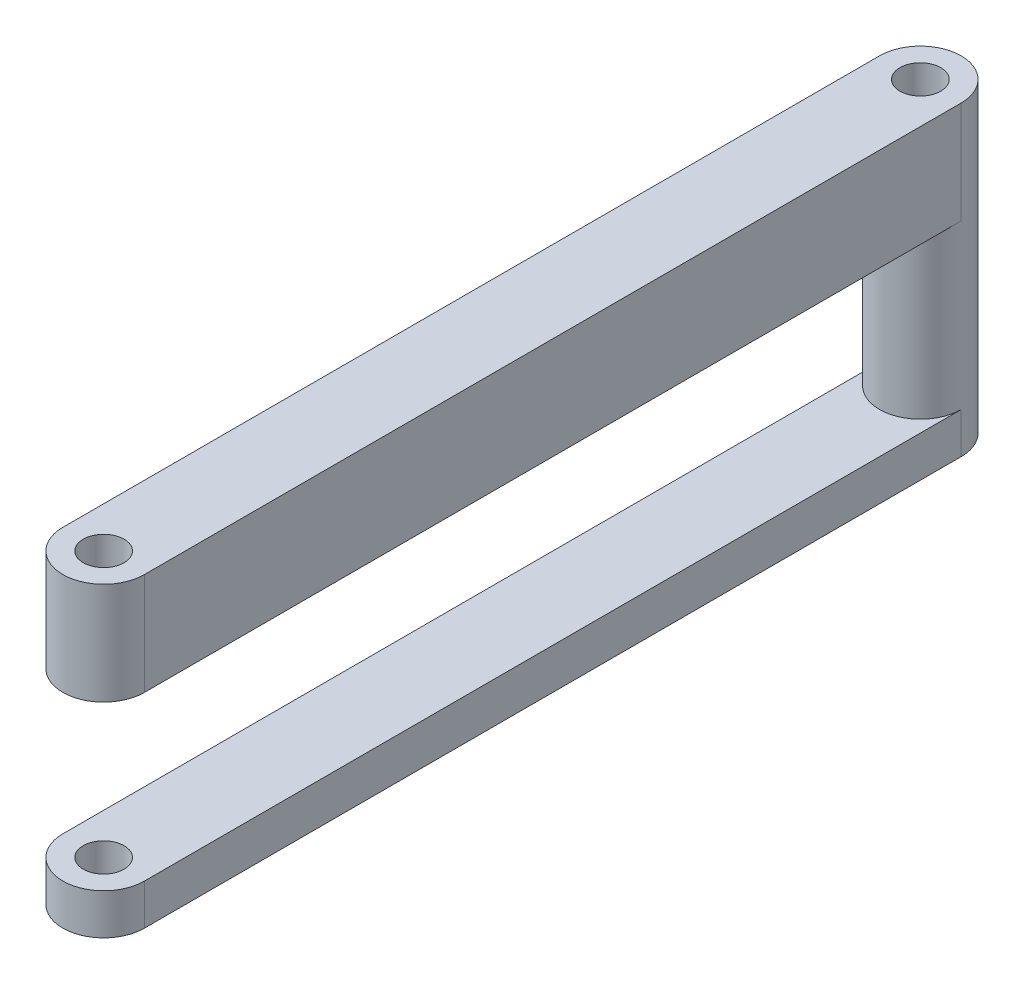
ISO-10303-21;
HEADER;
FILE_DESCRIPTION(('STEP AP214'),'2;1');
FILE_NAME('part.step','',(''),(''),'','','');
FILE_SCHEMA(('AUTOMOTIVE_DESIGN { 1 0 10303 214 1 1 1 1 }'));
ENDSEC;
DATA;
#1=APPLICATION_CONTEXT('core data for automotive mechanical design processes');
#2=APPLICATION_PROTOCOL_DEFINITION('international standard','automotive_design',2000,#1);
#3=PRODUCT_CONTEXT('',#1,'mechanical');
#4=PRODUCT('Part','Part','',(#3));
#5=PRODUCT_RELATED_PRODUCT_CATEGORY('part','',(#4));
#6=PRODUCT_DEFINITION_FORMATION('','',#4);
#7=PRODUCT_DEFINITION_CONTEXT('part definition',#1,'design');
#8=PRODUCT_DEFINITION('design','',#6,#7);
#9=PRODUCT_DEFINITION_SHAPE('','',#8);
#10=(LENGTH_UNIT() NAMED_UNIT(*) SI_UNIT(.MILLI.,.METRE.));
#11=(NAMED_UNIT(*) PLANE_ANGLE_UNIT() SI_UNIT($,.RADIAN.));
#12=(NAMED_UNIT(*) SI_UNIT($,.STERADIAN.) SOLID_ANGLE_UNIT());
#13=UNCERTAINTY_MEASURE_WITH_UNIT(LENGTH_MEASURE(1.E-05),#10,'distance_accuracy_value','');
#14=(GEOMETRIC_REPRESENTATION_CONTEXT(3) GLOBAL_UNCERTAINTY_ASSIGNED_CONTEXT((#13)) GLOBAL_UNIT_ASSIGNED_CONTEXT((#10,
#11,#12)) REPRESENTATION_CONTEXT('',''));
#15=CARTESIAN_POINT('',(0.,0.,0.));
#16=DIRECTION('',(0.,0.,1.));
#17=DIRECTION('',(1.,0.,0.));
#18=AXIS2_PLACEMENT_3D('',#15,#16,#17);
#19=CARTESIAN_POINT('',(0.,2.,0.));
#20=DIRECTION('',(0.,-1.,0.));
#21=DIRECTION('',(0.,0.,-1.));
#22=AXIS2_PLACEMENT_3D('',#19,#20,#21);
#23=CYLINDRICAL_SURFACE('',#22,2.);
#24=CARTESIAN_POINT('',(0.,0.,0.));
#25=DIRECTION('',(0.,1.,0.));
#26=DIRECTION('',(0.,0.,1.));
#27=AXIS2_PLACEMENT_3D('',#24,#25,#26);
#28=CIRCLE('',#27,2.);
#29=CARTESIAN_POINT('',(2.,0.,0.));
#30=VERTEX_POINT('',#29);
#31=CARTESIAN_POINT('',(-2.,0.,0.));
#32=VERTEX_POINT('',#31);
#33=EDGE_CURVE('E112',#30,#32,#28,.T.);
#34=ORIENTED_EDGE('',*,*,#33,.T.);
#35=DIRECTION('',(0.,-1.,0.));
#36=VECTOR('',#35,1.);
#37=CARTESIAN_POINT('',(-2.,2.,0.));
#38=LINE('',#37,#36);
#39=CARTESIAN_POINT('',(-2.,2.,0.));
#40=VERTEX_POINT('',#39);
#41=EDGE_CURVE('E123',#40,#32,#38,.T.);
#42=ORIENTED_EDGE('',*,*,#41,.F.);
#43=CARTESIAN_POINT('',(0.,2.,0.));
#44=DIRECTION('',(0.,1.,0.));
#45=DIRECTION('',(0.,0.,1.));
#46=AXIS2_PLACEMENT_3D('',#43,#44,#45);
#47=CIRCLE('',#46,2.);
#48=CARTESIAN_POINT('',(2.,2.,0.));
#49=VERTEX_POINT('',#48);
#50=EDGE_CURVE('E41',#40,#49,#47,.T.);
#51=ORIENTED_EDGE('',*,*,#50,.T.);
#52=DIRECTION('',(0.,-1.,0.));
#53=VECTOR('',#52,1.);
#54=CARTESIAN_POINT('',(2.,2.,0.));
#55=LINE('',#54,#53);
#56=EDGE_CURVE('E131',#49,#30,#55,.T.);
#57=ORIENTED_EDGE('',*,*,#56,.T.);
#58=EDGE_LOOP('',(#34,#42,#51,#57));
#59=FACE_BOUND('',#58,.T.);
#60=CARTESIAN_POINT('',(0.,10.,0.));
#61=DIRECTION('',(0.,1.,0.));
#62=DIRECTION('',(0.,0.,1.));
#63=AXIS2_PLACEMENT_3D('',#60,#61,#62);
#64=CIRCLE('',#63,2.);
#65=CARTESIAN_POINT('',(-2.,10.,0.));
#66=VERTEX_POINT('',#65);
#67=CARTESIAN_POINT('',(2.,10.,0.));
#68=VERTEX_POINT('',#67);
#69=EDGE_CURVE('E11',#66,#68,#64,.T.);
#70=ORIENTED_EDGE('',*,*,#69,.F.);
#71=DIRECTION('',(0.,-1.,0.));
#72=VECTOR('',#71,1.);
#73=CARTESIAN_POINT('',(-2.,15.,0.));
#74=LINE('',#73,#72);
#75=CARTESIAN_POINT('',(-2.,15.,0.));
#76=VERTEX_POINT('',#75);
#77=EDGE_CURVE('E55',#76,#66,#74,.T.);
#78=ORIENTED_EDGE('',*,*,#77,.F.);
#79=CARTESIAN_POINT('',(0.,15.,0.));
#80=DIRECTION('',(0.,1.,0.));
#81=DIRECTION('',(0.,0.,1.));
#82=AXIS2_PLACEMENT_3D('',#79,#80,#81);
#83=CIRCLE('',#82,2.);
#84=CARTESIAN_POINT('',(2.,15.,0.));
#85=VERTEX_POINT('',#84);
#86=EDGE_CURVE('E103',#85,#76,#83,.T.);
#87=ORIENTED_EDGE('',*,*,#86,.F.);
#88=DIRECTION('',(0.,-1.,0.));
#89=VECTOR('',#88,1.);
#90=CARTESIAN_POINT('',(2.,15.,0.));
#91=LINE('',#90,#89);
#92=EDGE_CURVE('E48',#85,#68,#91,.T.);
#93=ORIENTED_EDGE('',*,*,#92,.T.);
#94=EDGE_LOOP('',(#70,#78,#87,#93));
#95=FACE_BOUND('',#94,.T.);
#96=ADVANCED_FACE('F33',(#59,#95),#23,.T.);
#97=CARTESIAN_POINT('',(-2.,2.,0.));
#98=DIRECTION('',(1.,0.,0.));
#99=DIRECTION('',(0.,0.,-1.));
#100=AXIS2_PLACEMENT_3D('',#97,#98,#99);
#101=PLANE('',#100);
#102=DIRECTION('',(0.,0.,1.));
#103=VECTOR('',#102,1.);
#104=CARTESIAN_POINT('',(-2.,0.,0.));
#105=LINE('',#104,#103);
#106=CARTESIAN_POINT('',(-2.,0.,40.));
#107=VERTEX_POINT('',#106);
#108=EDGE_CURVE('E115',#32,#107,#105,.T.);
#109=ORIENTED_EDGE('',*,*,#108,.T.);
#110=DIRECTION('',(0.,-1.,0.));
#111=VECTOR('',#110,1.);
#112=CARTESIAN_POINT('',(-2.,2.,40.));
#113=LINE('',#112,#111);
#114=CARTESIAN_POINT('',(-2.,2.,40.));
#115=VERTEX_POINT('',#114);
#116=EDGE_CURVE('E142',#115,#107,#113,.T.);
#117=ORIENTED_EDGE('',*,*,#116,.F.);
#118=DIRECTION('',(0.,0.,1.));
#119=VECTOR('',#118,1.);
#120=CARTESIAN_POINT('',(-2.,2.,0.));
#121=LINE('',#120,#119);
#122=EDGE_CURVE('E124',#40,#115,#121,.T.);
#123=ORIENTED_EDGE('',*,*,#122,.F.);
#124=ORIENTED_EDGE('',*,*,#41,.T.);
#125=EDGE_LOOP('',(#109,#117,#123,#124));
#126=FACE_BOUND('',#125,.T.);
#127=ADVANCED_FACE('F149',(#126),#101,.F.);
#128=CARTESIAN_POINT('',(0.,2.,40.));
#129=DIRECTION('',(0.,-1.,0.));
#130=DIRECTION('',(0.,0.,-1.));
#131=AXIS2_PLACEMENT_3D('',#128,#129,#130);
#132=CYLINDRICAL_SURFACE('',#131,2.);
#133=CARTESIAN_POINT('',(0.,0.,40.));
#134=DIRECTION('',(0.,1.,0.));
#135=DIRECTION('',(0.,0.,1.));
#136=AXIS2_PLACEMENT_3D('',#133,#134,#135);
#137=CIRCLE('',#136,2.);
#138=CARTESIAN_POINT('',(2.,0.,40.));
#139=VERTEX_POINT('',#138);
#140=EDGE_CURVE('E134',#107,#139,#137,.T.);
#141=ORIENTED_EDGE('',*,*,#140,.T.);
#142=DIRECTION('',(0.,-1.,0.));
#143=VECTOR('',#142,1.);
#144=CARTESIAN_POINT('',(2.,2.,40.));
#145=LINE('',#144,#143);
#146=CARTESIAN_POINT('',(2.,2.,40.));
#147=VERTEX_POINT('',#146);
#148=EDGE_CURVE('E140',#147,#139,#145,.T.);
#149=ORIENTED_EDGE('',*,*,#148,.F.);
#150=CARTESIAN_POINT('',(0.,2.,40.));
#151=DIRECTION('',(0.,1.,0.));
#152=DIRECTION('',(0.,0.,1.));
#153=AXIS2_PLACEMENT_3D('',#150,#151,#152);
#154=CIRCLE('',#153,2.);
#155=EDGE_CURVE('E126',#115,#147,#154,.T.);
#156=ORIENTED_EDGE('',*,*,#155,.F.);
#157=ORIENTED_EDGE('',*,*,#116,.T.);
#158=EDGE_LOOP('',(#141,#149,#156,#157));
#159=FACE_BOUND('',#158,.T.);
#160=ADVANCED_FACE('F163',(#159),#132,.T.);
#161=CARTESIAN_POINT('',(2.,2.,0.));
#162=DIRECTION('',(1.,0.,0.));
#163=DIRECTION('',(0.,0.,-1.));
#164=AXIS2_PLACEMENT_3D('',#161,#162,#163);
#165=PLANE('',#164);
#166=DIRECTION('',(0.,0.,1.));
#167=VECTOR('',#166,1.);
#168=CARTESIAN_POINT('',(2.,0.,0.));
#169=LINE('',#168,#167);
#170=EDGE_CURVE('E127',#30,#139,#169,.T.);
#171=ORIENTED_EDGE('',*,*,#170,.F.);
#172=ORIENTED_EDGE('',*,*,#56,.F.);
#173=DIRECTION('',(0.,0.,1.));
#174=VECTOR('',#173,1.);
#175=CARTESIAN_POINT('',(2.,2.,0.));
#176=LINE('',#175,#174);
#177=EDGE_CURVE('E129',#49,#147,#176,.T.);
#178=ORIENTED_EDGE('',*,*,#177,.T.);
#179=ORIENTED_EDGE('',*,*,#148,.T.);
#180=EDGE_LOOP('',(#171,#172,#178,#179));
#181=FACE_BOUND('',#180,.T.);
#182=ADVANCED_FACE('F159',(#181),#165,.T.);
#183=CARTESIAN_POINT('',(0.,2.,0.));
#184=DIRECTION('',(0.,1.,0.));
#185=DIRECTION('',(0.,0.,1.));
#186=AXIS2_PLACEMENT_3D('',#183,#184,#185);
#187=PLANE('',#186);
#188=CARTESIAN_POINT('',(0.,2.,40.));
#189=DIRECTION('',(0.,1.,0.));
#190=DIRECTION('',(0.,0.,1.));
#191=AXIS2_PLACEMENT_3D('',#188,#189,#190);
#192=CIRCLE('',#191,0.999999999999992);
#193=CARTESIAN_POINT('',(0.,2.,41.));
#194=VERTEX_POINT('',#193);
#195=EDGE_CURVE('E36',#194,#194,#192,.T.);
#196=ORIENTED_EDGE('',*,*,#195,.F.);
#197=EDGE_LOOP('',(#196));
#198=FACE_BOUND('',#197,.T.);
#199=ORIENTED_EDGE('',*,*,#50,.F.);
#200=ORIENTED_EDGE('',*,*,#122,.T.);
#201=ORIENTED_EDGE('',*,*,#155,.T.);
#202=ORIENTED_EDGE('',*,*,#177,.F.);
#203=EDGE_LOOP('',(#199,#200,#201,#202));
#204=FACE_BOUND('',#203,.T.);
#205=ADVANCED_FACE('F165',(#198,#204),#187,.T.);
#206=CARTESIAN_POINT('',(0.,0.,0.));
#207=DIRECTION('',(0.,1.,0.));
#208=DIRECTION('',(0.,0.,1.));
#209=AXIS2_PLACEMENT_3D('',#206,#207,#208);
#210=PLANE('',#209);
#211=CARTESIAN_POINT('',(0.,0.,0.));
#212=DIRECTION('',(0.,1.,0.));
#213=DIRECTION('',(0.,0.,1.));
#214=AXIS2_PLACEMENT_3D('',#211,#212,#213);
#215=CIRCLE('',#214,0.999999999999996);
#216=CARTESIAN_POINT('',(0.,0.,0.999999999999996));
#217=VERTEX_POINT('',#216);
#218=EDGE_CURVE('E294',#217,#217,#215,.T.);
#219=ORIENTED_EDGE('',*,*,#218,.T.);
#220=EDGE_LOOP('',(#219));
#221=FACE_BOUND('',#220,.T.);
#222=CARTESIAN_POINT('',(0.,0.,40.));
#223=DIRECTION('',(0.,1.,0.));
#224=DIRECTION('',(0.,0.,1.));
#225=AXIS2_PLACEMENT_3D('',#222,#223,#224);
#226=CIRCLE('',#225,0.999999999999996);
#227=CARTESIAN_POINT('',(0.,0.,41.));
#228=VERTEX_POINT('',#227);
#229=EDGE_CURVE('E304',#228,#228,#226,.T.);
#230=ORIENTED_EDGE('',*,*,#229,.T.);
#231=EDGE_LOOP('',(#230));
#232=FACE_BOUND('',#231,.T.);
#233=ORIENTED_EDGE('',*,*,#33,.F.);
#234=ORIENTED_EDGE('',*,*,#170,.T.);
#235=ORIENTED_EDGE('',*,*,#140,.F.);
#236=ORIENTED_EDGE('',*,*,#108,.F.);
#237=EDGE_LOOP('',(#233,#234,#235,#236));
#238=FACE_BOUND('',#237,.T.);
#239=ADVANCED_FACE('F156',(#221,#232,#238),#210,.F.);
#240=CARTESIAN_POINT('',(-2.,15.,0.));
#241=DIRECTION('',(1.,0.,0.));
#242=DIRECTION('',(0.,0.,-1.));
#243=AXIS2_PLACEMENT_3D('',#240,#241,#242);
#244=PLANE('',#243);
#245=DIRECTION('',(0.,0.,1.));
#246=VECTOR('',#245,1.);
#247=CARTESIAN_POINT('',(-2.,10.,0.));
#248=LINE('',#247,#246);
#249=CARTESIAN_POINT('',(-2.,10.,40.));
#250=VERTEX_POINT('',#249);
#251=EDGE_CURVE('E309',#66,#250,#248,.T.);
#252=ORIENTED_EDGE('',*,*,#251,.T.);
#253=DIRECTION('',(0.,-1.,0.));
#254=VECTOR('',#253,1.);
#255=CARTESIAN_POINT('',(-2.,15.,40.));
#256=LINE('',#255,#254);
#257=CARTESIAN_POINT('',(-2.,15.,40.));
#258=VERTEX_POINT('',#257);
#259=EDGE_CURVE('E99',#258,#250,#256,.T.);
#260=ORIENTED_EDGE('',*,*,#259,.F.);
#261=DIRECTION('',(0.,0.,1.));
#262=VECTOR('',#261,1.);
#263=CARTESIAN_POINT('',(-2.,15.,0.));
#264=LINE('',#263,#262);
#265=EDGE_CURVE('E95',#76,#258,#264,.T.);
#266=ORIENTED_EDGE('',*,*,#265,.F.);
#267=ORIENTED_EDGE('',*,*,#77,.T.);
#268=EDGE_LOOP('',(#252,#260,#266,#267));
#269=FACE_BOUND('',#268,.T.);
#270=ADVANCED_FACE('F97',(#269),#244,.F.);
#271=CARTESIAN_POINT('',(0.,15.,40.));
#272=DIRECTION('',(0.,-1.,0.));
#273=DIRECTION('',(0.,0.,-1.));
#274=AXIS2_PLACEMENT_3D('',#271,#272,#273);
#275=CYLINDRICAL_SURFACE('',#274,2.);
#276=CARTESIAN_POINT('',(0.,10.,40.));
#277=DIRECTION('',(0.,1.,0.));
#278=DIRECTION('',(0.,0.,1.));
#279=AXIS2_PLACEMENT_3D('',#276,#277,#278);
#280=CIRCLE('',#279,2.);
#281=CARTESIAN_POINT('',(2.,10.,40.));
#282=VERTEX_POINT('',#281);
#283=EDGE_CURVE('E314',#250,#282,#280,.T.);
#284=ORIENTED_EDGE('',*,*,#283,.T.);
#285=DIRECTION('',(0.,-1.,0.));
#286=VECTOR('',#285,1.);
#287=CARTESIAN_POINT('',(2.,15.,40.));
#288=LINE('',#287,#286);
#289=CARTESIAN_POINT('',(2.,15.,40.));
#290=VERTEX_POINT('',#289);
#291=EDGE_CURVE('E117',#290,#282,#288,.T.);
#292=ORIENTED_EDGE('',*,*,#291,.F.);
#293=CARTESIAN_POINT('',(0.,15.,40.));
#294=DIRECTION('',(0.,1.,0.));
#295=DIRECTION('',(0.,0.,1.));
#296=AXIS2_PLACEMENT_3D('',#293,#294,#295);
#297=CIRCLE('',#296,2.);
#298=EDGE_CURVE('E102',#258,#290,#297,.T.);
#299=ORIENTED_EDGE('',*,*,#298,.F.);
#300=ORIENTED_EDGE('',*,*,#259,.T.);
#301=EDGE_LOOP('',(#284,#292,#299,#300));
#302=FACE_BOUND('',#301,.T.);
#303=ADVANCED_FACE('F211',(#302),#275,.T.);
#304=CARTESIAN_POINT('',(2.,15.,0.));
#305=DIRECTION('',(-1.,0.,0.));
#306=DIRECTION('',(0.,0.,1.));
#307=AXIS2_PLACEMENT_3D('',#304,#305,#306);
#308=PLANE('',#307);
#309=DIRECTION('',(0.,0.,-1.));
#310=VECTOR('',#309,1.);
#311=CARTESIAN_POINT('',(2.,10.,0.));
#312=LINE('',#311,#310);
#313=EDGE_CURVE('E109',#282,#68,#312,.T.);
#314=ORIENTED_EDGE('',*,*,#313,.T.);
#315=ORIENTED_EDGE('',*,*,#92,.F.);
#316=DIRECTION('',(0.,0.,-1.));
#317=VECTOR('',#316,1.);
#318=CARTESIAN_POINT('',(2.,15.,0.));
#319=LINE('',#318,#317);
#320=EDGE_CURVE('E108',#290,#85,#319,.T.);
#321=ORIENTED_EDGE('',*,*,#320,.F.);
#322=ORIENTED_EDGE('',*,*,#291,.T.);
#323=EDGE_LOOP('',(#314,#315,#321,#322));
#324=FACE_BOUND('',#323,.T.);
#325=ADVANCED_FACE('F219',(#324),#308,.F.);
#326=CARTESIAN_POINT('',(0.,15.,0.));
#327=DIRECTION('',(0.,1.,0.));
#328=DIRECTION('',(0.,0.,1.));
#329=AXIS2_PLACEMENT_3D('',#326,#327,#328);
#330=PLANE('',#329);
#331=CARTESIAN_POINT('',(0.,15.,0.));
#332=DIRECTION('',(0.,1.,0.));
#333=DIRECTION('',(0.,0.,1.));
#334=AXIS2_PLACEMENT_3D('',#331,#332,#333);
#335=CIRCLE('',#334,0.999999999999987);
#336=CARTESIAN_POINT('',(0.,15.,0.999999999999987));
#337=VERTEX_POINT('',#336);
#338=EDGE_CURVE('E297',#337,#337,#335,.T.);
#339=ORIENTED_EDGE('',*,*,#338,.F.);
#340=EDGE_LOOP('',(#339));
#341=FACE_BOUND('',#340,.T.);
#342=CARTESIAN_POINT('',(0.,15.,40.));
#343=DIRECTION('',(0.,1.,0.));
#344=DIRECTION('',(0.,0.,1.));
#345=AXIS2_PLACEMENT_3D('',#342,#343,#344);
#346=CIRCLE('',#345,0.999999999999987);
#347=CARTESIAN_POINT('',(0.,15.,41.));
#348=VERTEX_POINT('',#347);
#349=EDGE_CURVE('E299',#348,#348,#346,.T.);
#350=ORIENTED_EDGE('',*,*,#349,.F.);
#351=EDGE_LOOP('',(#350));
#352=FACE_BOUND('',#351,.T.);
#353=ORIENTED_EDGE('',*,*,#86,.T.);
#354=ORIENTED_EDGE('',*,*,#265,.T.);
#355=ORIENTED_EDGE('',*,*,#298,.T.);
#356=ORIENTED_EDGE('',*,*,#320,.T.);
#357=EDGE_LOOP('',(#353,#354,#355,#356));
#358=FACE_BOUND('',#357,.T.);
#359=ADVANCED_FACE('F106',(#341,#352,#358),#330,.T.);
#360=CARTESIAN_POINT('',(0.,10.,0.));
#361=DIRECTION('',(0.,1.,0.));
#362=DIRECTION('',(0.,0.,1.));
#363=AXIS2_PLACEMENT_3D('',#360,#361,#362);
#364=PLANE('',#363);
#365=CARTESIAN_POINT('',(0.,10.,40.));
#366=DIRECTION('',(0.,1.,0.));
#367=DIRECTION('',(0.,0.,1.));
#368=AXIS2_PLACEMENT_3D('',#365,#366,#367);
#369=CIRCLE('',#368,0.999999999999992);
#370=CARTESIAN_POINT('',(0.,10.,41.));
#371=VERTEX_POINT('',#370);
#372=EDGE_CURVE('E307',#371,#371,#369,.T.);
#373=ORIENTED_EDGE('',*,*,#372,.T.);
#374=EDGE_LOOP('',(#373));
#375=FACE_BOUND('',#374,.T.);
#376=ORIENTED_EDGE('',*,*,#251,.F.);
#377=ORIENTED_EDGE('',*,*,#69,.T.);
#378=ORIENTED_EDGE('',*,*,#313,.F.);
#379=ORIENTED_EDGE('',*,*,#283,.F.);
#380=EDGE_LOOP('',(#376,#377,#378,#379));
#381=FACE_BOUND('',#380,.T.);
#382=ADVANCED_FACE('F248',(#375,#381),#364,.F.);
#383=CARTESIAN_POINT('',(0.,15.,40.));
#384=DIRECTION('',(0.,1.,0.));
#385=DIRECTION('',(0.,0.,1.));
#386=AXIS2_PLACEMENT_3D('',#383,#384,#385);
#387=CYLINDRICAL_SURFACE('',#386,0.999999999999992);
#388=ORIENTED_EDGE('',*,*,#195,.T.);
#389=EDGE_LOOP('',(#388));
#390=FACE_BOUND('',#389,.T.);
#391=ORIENTED_EDGE('',*,*,#229,.F.);
#392=EDGE_LOOP('',(#391));
#393=FACE_BOUND('',#392,.T.);
#394=ADVANCED_FACE('F258',(#390,#393),#387,.F.);
#395=ORIENTED_EDGE('',*,*,#349,.T.);
#396=EDGE_LOOP('',(#395));
#397=FACE_BOUND('',#396,.T.);
#398=ORIENTED_EDGE('',*,*,#372,.F.);
#399=EDGE_LOOP('',(#398));
#400=FACE_BOUND('',#399,.T.);
#401=ADVANCED_FACE('F268',(#397,#400),#387,.F.);
#402=CARTESIAN_POINT('',(0.,15.,0.));
#403=DIRECTION('',(0.,1.,0.));
#404=DIRECTION('',(0.,0.,1.));
#405=AXIS2_PLACEMENT_3D('',#402,#403,#404);
#406=CYLINDRICAL_SURFACE('',#405,0.999999999999992);
#407=ORIENTED_EDGE('',*,*,#218,.F.);
#408=EDGE_LOOP('',(#407));
#409=FACE_BOUND('',#408,.T.);
#410=ORIENTED_EDGE('',*,*,#338,.T.);
#411=EDGE_LOOP('',(#410));
#412=FACE_BOUND('',#411,.T.);
#413=ADVANCED_FACE('F278',(#409,#412),#406,.F.);
#414=CLOSED_SHELL('',(#96,#127,#160,#182,#205,#239,#270,#303,#325,#359,#382,#394,#401,#413));
#415=MANIFOLD_SOLID_BREP('B2',#414);
#416=ADVANCED_BREP_SHAPE_REPRESENTATION('',(#18,#415),#14);
#417=SHAPE_DEFINITION_REPRESENTATION(#9,#416);
ENDSEC;
END-ISO-10303-21;
